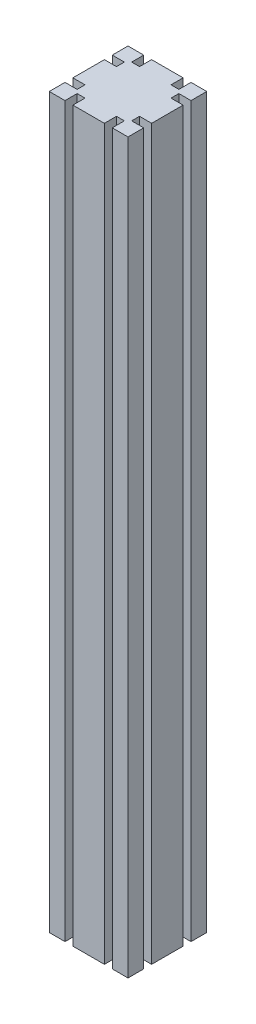
ISO-10303-21;
HEADER;
FILE_DESCRIPTION(('STEP AP214'),'2;1');
FILE_NAME('part.step','',(''),(''),'','','');
FILE_SCHEMA(('AUTOMOTIVE_DESIGN { 1 0 10303 214 1 1 1 1 }'));
ENDSEC;
DATA;
#1=APPLICATION_CONTEXT('core data for automotive mechanical design processes');
#2=APPLICATION_PROTOCOL_DEFINITION('international standard','automotive_design',2000,#1);
#3=PRODUCT_CONTEXT('',#1,'mechanical');
#4=PRODUCT('Part','Part','',(#3));
#5=PRODUCT_RELATED_PRODUCT_CATEGORY('part','',(#4));
#6=PRODUCT_DEFINITION_FORMATION('','',#4);
#7=PRODUCT_DEFINITION_CONTEXT('part definition',#1,'design');
#8=PRODUCT_DEFINITION('design','',#6,#7);
#9=PRODUCT_DEFINITION_SHAPE('','',#8);
#10=(LENGTH_UNIT() NAMED_UNIT(*) SI_UNIT(.MILLI.,.METRE.));
#11=(NAMED_UNIT(*) PLANE_ANGLE_UNIT() SI_UNIT($,.RADIAN.));
#12=(NAMED_UNIT(*) SI_UNIT($,.STERADIAN.) SOLID_ANGLE_UNIT());
#13=UNCERTAINTY_MEASURE_WITH_UNIT(LENGTH_MEASURE(1.E-05),#10,'distance_accuracy_value','');
#14=(GEOMETRIC_REPRESENTATION_CONTEXT(3) GLOBAL_UNCERTAINTY_ASSIGNED_CONTEXT((#13)) GLOBAL_UNIT_ASSIGNED_CONTEXT((#10,
#11,#12)) REPRESENTATION_CONTEXT('',''));
#15=CARTESIAN_POINT('',(0.,0.,0.));
#16=DIRECTION('',(0.,0.,1.));
#17=DIRECTION('',(1.,0.,0.));
#18=AXIS2_PLACEMENT_3D('',#15,#16,#17);
#19=CARTESIAN_POINT('',(-7.3207793932152,740.,0.));
#20=DIRECTION('',(-1.,0.,0.));
#21=DIRECTION('',(0.,0.,1.));
#22=AXIS2_PLACEMENT_3D('',#19,#20,#21);
#23=PLANE('',#22);
#24=DIRECTION('',(0.,0.,-1.));
#25=VECTOR('',#24,1.);
#26=CARTESIAN_POINT('',(-7.3207793932152,0.,0.));
#27=LINE('',#26,#25);
#28=CARTESIAN_POINT('',(-7.3207793932152,0.,-34.4799898452136));
#29=VERTEX_POINT('',#28);
#30=CARTESIAN_POINT('',(-7.3207793932152,0.,-50.4799898452136));
#31=VERTEX_POINT('',#30);
#32=EDGE_CURVE('E299',#29,#31,#27,.T.);
#33=ORIENTED_EDGE('',*,*,#32,.F.);
#34=DIRECTION('',(0.,-1.,0.));
#35=VECTOR('',#34,1.);
#36=CARTESIAN_POINT('',(-7.3207793932152,740.,-34.4799898452136));
#37=LINE('',#36,#35);
#38=CARTESIAN_POINT('',(-7.3207793932152,740.,-34.4799898452136));
#39=VERTEX_POINT('',#38);
#40=EDGE_CURVE('E11',#39,#29,#37,.T.);
#41=ORIENTED_EDGE('',*,*,#40,.F.);
#42=DIRECTION('',(0.,0.,-1.));
#43=VECTOR('',#42,1.);
#44=CARTESIAN_POINT('',(-7.3207793932152,740.,0.));
#45=LINE('',#44,#43);
#46=CARTESIAN_POINT('',(-7.3207793932152,740.,-50.4799898452136));
#47=VERTEX_POINT('',#46);
#48=EDGE_CURVE('E403',#39,#47,#45,.T.);
#49=ORIENTED_EDGE('',*,*,#48,.T.);
#50=DIRECTION('',(0.,-1.,0.));
#51=VECTOR('',#50,1.);
#52=CARTESIAN_POINT('',(-7.3207793932152,740.,-50.4799898452136));
#53=LINE('',#52,#51);
#54=EDGE_CURVE('E54',#47,#31,#53,.T.);
#55=ORIENTED_EDGE('',*,*,#54,.T.);
#56=EDGE_LOOP('',(#33,#41,#49,#55));
#57=FACE_BOUND('',#56,.T.);
#58=ADVANCED_FACE('F38',(#57),#23,.T.);
#59=CARTESIAN_POINT('',(0.,740.,-34.4799898452136));
#60=DIRECTION('',(0.,0.,1.));
#61=DIRECTION('',(1.,0.,0.));
#62=AXIS2_PLACEMENT_3D('',#59,#60,#61);
#63=PLANE('',#62);
#64=DIRECTION('',(-1.,0.,0.));
#65=VECTOR('',#64,1.);
#66=CARTESIAN_POINT('',(0.,0.,-34.4799898452136));
#67=LINE('',#66,#65);
#68=CARTESIAN_POINT('',(4.9792206067848,0.,-34.4799898452136));
#69=VERTEX_POINT('',#68);
#70=EDGE_CURVE('E301',#69,#29,#67,.T.);
#71=ORIENTED_EDGE('',*,*,#70,.F.);
#72=DIRECTION('',(0.,-1.,0.));
#73=VECTOR('',#72,1.);
#74=CARTESIAN_POINT('',(4.9792206067848,740.,-34.4799898452136));
#75=LINE('',#74,#73);
#76=CARTESIAN_POINT('',(4.9792206067848,740.,-34.4799898452136));
#77=VERTEX_POINT('',#76);
#78=EDGE_CURVE('E46',#77,#69,#75,.T.);
#79=ORIENTED_EDGE('',*,*,#78,.F.);
#80=DIRECTION('',(-1.,0.,0.));
#81=VECTOR('',#80,1.);
#82=CARTESIAN_POINT('',(0.,740.,-34.4799898452136));
#83=LINE('',#82,#81);
#84=EDGE_CURVE('E488',#77,#39,#83,.T.);
#85=ORIENTED_EDGE('',*,*,#84,.T.);
#86=ORIENTED_EDGE('',*,*,#40,.T.);
#87=EDGE_LOOP('',(#71,#79,#85,#86));
#88=FACE_BOUND('',#87,.T.);
#89=ADVANCED_FACE('F476',(#88),#63,.T.);
#90=CARTESIAN_POINT('',(4.9792206067848,740.,0.));
#91=DIRECTION('',(-1.,0.,0.));
#92=DIRECTION('',(0.,0.,1.));
#93=AXIS2_PLACEMENT_3D('',#90,#91,#92);
#94=PLANE('',#93);
#95=DIRECTION('',(0.,0.,-1.));
#96=VECTOR('',#95,1.);
#97=CARTESIAN_POINT('',(4.9792206067848,0.,0.));
#98=LINE('',#97,#96);
#99=CARTESIAN_POINT('',(4.9792206067848,0.,-26.4799898452136));
#100=VERTEX_POINT('',#99);
#101=EDGE_CURVE('E304',#100,#69,#98,.T.);
#102=ORIENTED_EDGE('',*,*,#101,.F.);
#103=DIRECTION('',(0.,-1.,0.));
#104=VECTOR('',#103,1.);
#105=CARTESIAN_POINT('',(4.9792206067848,740.,-26.4799898452136));
#106=LINE('',#105,#104);
#107=CARTESIAN_POINT('',(4.9792206067848,740.,-26.4799898452136));
#108=VERTEX_POINT('',#107);
#109=EDGE_CURVE('E465',#108,#100,#106,.T.);
#110=ORIENTED_EDGE('',*,*,#109,.F.);
#111=DIRECTION('',(0.,0.,-1.));
#112=VECTOR('',#111,1.);
#113=CARTESIAN_POINT('',(4.9792206067848,740.,0.));
#114=LINE('',#113,#112);
#115=EDGE_CURVE('E472',#108,#77,#114,.T.);
#116=ORIENTED_EDGE('',*,*,#115,.T.);
#117=ORIENTED_EDGE('',*,*,#78,.T.);
#118=EDGE_LOOP('',(#102,#110,#116,#117));
#119=FACE_BOUND('',#118,.T.);
#120=ADVANCED_FACE('F470',(#119),#94,.T.);
#121=CARTESIAN_POINT('',(0.,740.,-26.4799898452136));
#122=DIRECTION('',(0.,0.,-1.));
#123=DIRECTION('',(-1.,0.,0.));
#124=AXIS2_PLACEMENT_3D('',#121,#122,#123);
#125=PLANE('',#124);
#126=DIRECTION('',(1.,0.,0.));
#127=VECTOR('',#126,1.);
#128=CARTESIAN_POINT('',(0.,0.,-26.4799898452136));
#129=LINE('',#128,#127);
#130=CARTESIAN_POINT('',(-7.3207793932152,0.,-26.4799898452136));
#131=VERTEX_POINT('',#130);
#132=EDGE_CURVE('E307',#131,#100,#129,.T.);
#133=ORIENTED_EDGE('',*,*,#132,.F.);
#134=DIRECTION('',(0.,-1.,0.));
#135=VECTOR('',#134,1.);
#136=CARTESIAN_POINT('',(-7.3207793932152,740.,-26.4799898452136));
#137=LINE('',#136,#135);
#138=CARTESIAN_POINT('',(-7.3207793932152,740.,-26.4799898452136));
#139=VERTEX_POINT('',#138);
#140=EDGE_CURVE('E463',#139,#131,#137,.T.);
#141=ORIENTED_EDGE('',*,*,#140,.F.);
#142=DIRECTION('',(1.,0.,0.));
#143=VECTOR('',#142,1.);
#144=CARTESIAN_POINT('',(0.,740.,-26.4799898452136));
#145=LINE('',#144,#143);
#146=EDGE_CURVE('E485',#139,#108,#145,.T.);
#147=ORIENTED_EDGE('',*,*,#146,.T.);
#148=ORIENTED_EDGE('',*,*,#109,.T.);
#149=EDGE_LOOP('',(#133,#141,#147,#148));
#150=FACE_BOUND('',#149,.T.);
#151=ADVANCED_FACE('F482',(#150),#125,.T.);
#152=CARTESIAN_POINT('',(-7.3207793932152,740.,0.));
#153=DIRECTION('',(-1.,0.,0.));
#154=DIRECTION('',(0.,0.,1.));
#155=AXIS2_PLACEMENT_3D('',#152,#153,#154);
#156=PLANE('',#155);
#157=DIRECTION('',(0.,0.,-1.));
#158=VECTOR('',#157,1.);
#159=CARTESIAN_POINT('',(-7.3207793932152,0.,0.));
#160=LINE('',#159,#158);
#161=CARTESIAN_POINT('',(-7.3207793932152,0.,5.52001015478639));
#162=VERTEX_POINT('',#161);
#163=EDGE_CURVE('E310',#162,#131,#160,.T.);
#164=ORIENTED_EDGE('',*,*,#163,.F.);
#165=DIRECTION('',(0.,-1.,0.));
#166=VECTOR('',#165,1.);
#167=CARTESIAN_POINT('',(-7.3207793932152,740.,5.52001015478639));
#168=LINE('',#167,#166);
#169=CARTESIAN_POINT('',(-7.3207793932152,740.,5.52001015478639));
#170=VERTEX_POINT('',#169);
#171=EDGE_CURVE('E461',#170,#162,#168,.T.);
#172=ORIENTED_EDGE('',*,*,#171,.F.);
#173=DIRECTION('',(0.,0.,-1.));
#174=VECTOR('',#173,1.);
#175=CARTESIAN_POINT('',(-7.3207793932152,740.,0.));
#176=LINE('',#175,#174);
#177=EDGE_CURVE('E490',#170,#139,#176,.T.);
#178=ORIENTED_EDGE('',*,*,#177,.T.);
#179=ORIENTED_EDGE('',*,*,#140,.T.);
#180=EDGE_LOOP('',(#164,#172,#178,#179));
#181=FACE_BOUND('',#180,.T.);
#182=ADVANCED_FACE('F601',(#181),#156,.T.);
#183=CARTESIAN_POINT('',(0.,740.,5.52001015478639));
#184=DIRECTION('',(0.,0.,1.));
#185=DIRECTION('',(1.,0.,0.));
#186=AXIS2_PLACEMENT_3D('',#183,#184,#185);
#187=PLANE('',#186);
#188=DIRECTION('',(-1.,0.,0.));
#189=VECTOR('',#188,1.);
#190=CARTESIAN_POINT('',(0.,0.,5.52001015478639));
#191=LINE('',#190,#189);
#192=CARTESIAN_POINT('',(4.9792206067848,0.,5.52001015478639));
#193=VERTEX_POINT('',#192);
#194=EDGE_CURVE('E313',#193,#162,#191,.T.);
#195=ORIENTED_EDGE('',*,*,#194,.F.);
#196=DIRECTION('',(0.,-1.,0.));
#197=VECTOR('',#196,1.);
#198=CARTESIAN_POINT('',(4.9792206067848,740.,5.52001015478639));
#199=LINE('',#198,#197);
#200=CARTESIAN_POINT('',(4.9792206067848,740.,5.52001015478639));
#201=VERTEX_POINT('',#200);
#202=EDGE_CURVE('E459',#201,#193,#199,.T.);
#203=ORIENTED_EDGE('',*,*,#202,.F.);
#204=DIRECTION('',(-1.,0.,0.));
#205=VECTOR('',#204,1.);
#206=CARTESIAN_POINT('',(0.,740.,5.52001015478639));
#207=LINE('',#206,#205);
#208=EDGE_CURVE('E496',#201,#170,#207,.T.);
#209=ORIENTED_EDGE('',*,*,#208,.T.);
#210=ORIENTED_EDGE('',*,*,#171,.T.);
#211=EDGE_LOOP('',(#195,#203,#209,#210));
#212=FACE_BOUND('',#211,.T.);
#213=ADVANCED_FACE('F604',(#212),#187,.T.);
#214=CARTESIAN_POINT('',(4.9792206067848,740.,0.));
#215=DIRECTION('',(-1.,0.,0.));
#216=DIRECTION('',(0.,0.,1.));
#217=AXIS2_PLACEMENT_3D('',#214,#215,#216);
#218=PLANE('',#217);
#219=DIRECTION('',(0.,0.,-1.));
#220=VECTOR('',#219,1.);
#221=CARTESIAN_POINT('',(4.9792206067848,0.,0.));
#222=LINE('',#221,#220);
#223=CARTESIAN_POINT('',(4.9792206067848,0.,13.5200101547863));
#224=VERTEX_POINT('',#223);
#225=EDGE_CURVE('E316',#224,#193,#222,.T.);
#226=ORIENTED_EDGE('',*,*,#225,.F.);
#227=DIRECTION('',(0.,-1.,0.));
#228=VECTOR('',#227,1.);
#229=CARTESIAN_POINT('',(4.9792206067848,740.,13.5200101547863));
#230=LINE('',#229,#228);
#231=CARTESIAN_POINT('',(4.9792206067848,740.,13.5200101547863));
#232=VERTEX_POINT('',#231);
#233=EDGE_CURVE('E457',#232,#224,#230,.T.);
#234=ORIENTED_EDGE('',*,*,#233,.F.);
#235=DIRECTION('',(0.,0.,-1.));
#236=VECTOR('',#235,1.);
#237=CARTESIAN_POINT('',(4.9792206067848,740.,0.));
#238=LINE('',#237,#236);
#239=EDGE_CURVE('E499',#232,#201,#238,.T.);
#240=ORIENTED_EDGE('',*,*,#239,.T.);
#241=ORIENTED_EDGE('',*,*,#202,.T.);
#242=EDGE_LOOP('',(#226,#234,#240,#241));
#243=FACE_BOUND('',#242,.T.);
#244=ADVANCED_FACE('F608',(#243),#218,.T.);
#245=CARTESIAN_POINT('',(0.,740.,13.5200101547863));
#246=DIRECTION('',(0.,0.,-1.));
#247=DIRECTION('',(-1.,0.,0.));
#248=AXIS2_PLACEMENT_3D('',#245,#246,#247);
#249=PLANE('',#248);
#250=DIRECTION('',(1.,0.,0.));
#251=VECTOR('',#250,1.);
#252=CARTESIAN_POINT('',(0.,0.,13.5200101547863));
#253=LINE('',#252,#251);
#254=CARTESIAN_POINT('',(-7.32077939321523,0.,13.5200101547863));
#255=VERTEX_POINT('',#254);
#256=EDGE_CURVE('E319',#255,#224,#253,.T.);
#257=ORIENTED_EDGE('',*,*,#256,.F.);
#258=DIRECTION('',(0.,-1.,0.));
#259=VECTOR('',#258,1.);
#260=CARTESIAN_POINT('',(-7.32077939321523,740.,13.5200101547863));
#261=LINE('',#260,#259);
#262=CARTESIAN_POINT('',(-7.32077939321523,740.,13.5200101547863));
#263=VERTEX_POINT('',#262);
#264=EDGE_CURVE('E455',#263,#255,#261,.T.);
#265=ORIENTED_EDGE('',*,*,#264,.F.);
#266=DIRECTION('',(1.,0.,0.));
#267=VECTOR('',#266,1.);
#268=CARTESIAN_POINT('',(0.,740.,13.5200101547863));
#269=LINE('',#268,#267);
#270=EDGE_CURVE('E502',#263,#232,#269,.T.);
#271=ORIENTED_EDGE('',*,*,#270,.T.);
#272=ORIENTED_EDGE('',*,*,#233,.T.);
#273=EDGE_LOOP('',(#257,#265,#271,#272));
#274=FACE_BOUND('',#273,.T.);
#275=ADVANCED_FACE('F612',(#274),#249,.T.);
#276=CARTESIAN_POINT('',(-7.32077939321523,740.,0.));
#277=DIRECTION('',(-1.,0.,0.));
#278=DIRECTION('',(0.,0.,1.));
#279=AXIS2_PLACEMENT_3D('',#276,#277,#278);
#280=PLANE('',#279);
#281=DIRECTION('',(0.,0.,-1.));
#282=VECTOR('',#281,1.);
#283=CARTESIAN_POINT('',(-7.32077939321523,0.,0.));
#284=LINE('',#283,#282);
#285=CARTESIAN_POINT('',(-7.32077939321523,0.,29.5200101547863));
#286=VERTEX_POINT('',#285);
#287=EDGE_CURVE('E322',#286,#255,#284,.T.);
#288=ORIENTED_EDGE('',*,*,#287,.F.);
#289=DIRECTION('',(0.,-1.,0.));
#290=VECTOR('',#289,1.);
#291=CARTESIAN_POINT('',(-7.32077939321523,740.,29.5200101547863));
#292=LINE('',#291,#290);
#293=CARTESIAN_POINT('',(-7.32077939321523,740.,29.5200101547863));
#294=VERTEX_POINT('',#293);
#295=EDGE_CURVE('E453',#294,#286,#292,.T.);
#296=ORIENTED_EDGE('',*,*,#295,.F.);
#297=DIRECTION('',(0.,0.,-1.));
#298=VECTOR('',#297,1.);
#299=CARTESIAN_POINT('',(-7.32077939321523,740.,0.));
#300=LINE('',#299,#298);
#301=EDGE_CURVE('E505',#294,#263,#300,.T.);
#302=ORIENTED_EDGE('',*,*,#301,.T.);
#303=ORIENTED_EDGE('',*,*,#264,.T.);
#304=EDGE_LOOP('',(#288,#296,#302,#303));
#305=FACE_BOUND('',#304,.T.);
#306=ADVANCED_FACE('F616',(#305),#280,.T.);
#307=CARTESIAN_POINT('',(0.,740.,29.5200101547863));
#308=DIRECTION('',(0.,0.,1.));
#309=DIRECTION('',(1.,0.,0.));
#310=AXIS2_PLACEMENT_3D('',#307,#308,#309);
#311=PLANE('',#310);
#312=DIRECTION('',(-1.,0.,0.));
#313=VECTOR('',#312,1.);
#314=CARTESIAN_POINT('',(0.,0.,29.5200101547863));
#315=LINE('',#314,#313);
#316=CARTESIAN_POINT('',(8.67922060678477,0.,29.5200101547863));
#317=VERTEX_POINT('',#316);
#318=EDGE_CURVE('E325',#317,#286,#315,.T.);
#319=ORIENTED_EDGE('',*,*,#318,.F.);
#320=DIRECTION('',(0.,-1.,0.));
#321=VECTOR('',#320,1.);
#322=CARTESIAN_POINT('',(8.67922060678477,740.,29.5200101547863));
#323=LINE('',#322,#321);
#324=CARTESIAN_POINT('',(8.67922060678477,740.,29.5200101547863));
#325=VERTEX_POINT('',#324);
#326=EDGE_CURVE('E451',#325,#317,#323,.T.);
#327=ORIENTED_EDGE('',*,*,#326,.F.);
#328=DIRECTION('',(-1.,0.,0.));
#329=VECTOR('',#328,1.);
#330=CARTESIAN_POINT('',(0.,740.,29.5200101547863));
#331=LINE('',#330,#329);
#332=EDGE_CURVE('E508',#325,#294,#331,.T.);
#333=ORIENTED_EDGE('',*,*,#332,.T.);
#334=ORIENTED_EDGE('',*,*,#295,.T.);
#335=EDGE_LOOP('',(#319,#327,#333,#334));
#336=FACE_BOUND('',#335,.T.);
#337=ADVANCED_FACE('F620',(#336),#311,.T.);
#338=CARTESIAN_POINT('',(8.67922060678478,740.,0.));
#339=DIRECTION('',(1.,0.,0.));
#340=DIRECTION('',(0.,0.,-1.));
#341=AXIS2_PLACEMENT_3D('',#338,#339,#340);
#342=PLANE('',#341);
#343=DIRECTION('',(0.,0.,1.));
#344=VECTOR('',#343,1.);
#345=CARTESIAN_POINT('',(8.67922060678478,0.,0.));
#346=LINE('',#345,#344);
#347=CARTESIAN_POINT('',(8.67922060678478,0.,17.2200101547863));
#348=VERTEX_POINT('',#347);
#349=EDGE_CURVE('E328',#348,#317,#346,.T.);
#350=ORIENTED_EDGE('',*,*,#349,.F.);
#351=DIRECTION('',(0.,-1.,0.));
#352=VECTOR('',#351,1.);
#353=CARTESIAN_POINT('',(8.67922060678478,740.,17.2200101547863));
#354=LINE('',#353,#352);
#355=CARTESIAN_POINT('',(8.67922060678478,740.,17.2200101547863));
#356=VERTEX_POINT('',#355);
#357=EDGE_CURVE('E449',#356,#348,#354,.T.);
#358=ORIENTED_EDGE('',*,*,#357,.F.);
#359=DIRECTION('',(0.,0.,1.));
#360=VECTOR('',#359,1.);
#361=CARTESIAN_POINT('',(8.67922060678478,740.,0.));
#362=LINE('',#361,#360);
#363=EDGE_CURVE('E511',#356,#325,#362,.T.);
#364=ORIENTED_EDGE('',*,*,#363,.T.);
#365=ORIENTED_EDGE('',*,*,#326,.T.);
#366=EDGE_LOOP('',(#350,#358,#364,#365));
#367=FACE_BOUND('',#366,.T.);
#368=ADVANCED_FACE('F624',(#367),#342,.T.);
#369=CARTESIAN_POINT('',(0.,740.,17.2200101547863));
#370=DIRECTION('',(0.,0.,1.));
#371=DIRECTION('',(1.,0.,0.));
#372=AXIS2_PLACEMENT_3D('',#369,#370,#371);
#373=PLANE('',#372);
#374=DIRECTION('',(-1.,0.,0.));
#375=VECTOR('',#374,1.);
#376=CARTESIAN_POINT('',(0.,0.,17.2200101547863));
#377=LINE('',#376,#375);
#378=CARTESIAN_POINT('',(16.6792206067848,0.,17.2200101547863));
#379=VERTEX_POINT('',#378);
#380=EDGE_CURVE('E331',#379,#348,#377,.T.);
#381=ORIENTED_EDGE('',*,*,#380,.F.);
#382=DIRECTION('',(0.,-1.,0.));
#383=VECTOR('',#382,1.);
#384=CARTESIAN_POINT('',(16.6792206067848,740.,17.2200101547863));
#385=LINE('',#384,#383);
#386=CARTESIAN_POINT('',(16.6792206067848,740.,17.2200101547863));
#387=VERTEX_POINT('',#386);
#388=EDGE_CURVE('E447',#387,#379,#385,.T.);
#389=ORIENTED_EDGE('',*,*,#388,.F.);
#390=DIRECTION('',(-1.,0.,0.));
#391=VECTOR('',#390,1.);
#392=CARTESIAN_POINT('',(0.,740.,17.2200101547863));
#393=LINE('',#392,#391);
#394=EDGE_CURVE('E514',#387,#356,#393,.T.);
#395=ORIENTED_EDGE('',*,*,#394,.T.);
#396=ORIENTED_EDGE('',*,*,#357,.T.);
#397=EDGE_LOOP('',(#381,#389,#395,#396));
#398=FACE_BOUND('',#397,.T.);
#399=ADVANCED_FACE('F628',(#398),#373,.T.);
#400=CARTESIAN_POINT('',(16.6792206067848,740.,0.));
#401=DIRECTION('',(-1.,0.,0.));
#402=DIRECTION('',(0.,0.,1.));
#403=AXIS2_PLACEMENT_3D('',#400,#401,#402);
#404=PLANE('',#403);
#405=DIRECTION('',(0.,0.,-1.));
#406=VECTOR('',#405,1.);
#407=CARTESIAN_POINT('',(16.6792206067848,0.,0.));
#408=LINE('',#407,#406);
#409=CARTESIAN_POINT('',(16.6792206067848,0.,29.5200101547863));
#410=VERTEX_POINT('',#409);
#411=EDGE_CURVE('E334',#410,#379,#408,.T.);
#412=ORIENTED_EDGE('',*,*,#411,.F.);
#413=DIRECTION('',(0.,-1.,0.));
#414=VECTOR('',#413,1.);
#415=CARTESIAN_POINT('',(16.6792206067848,740.,29.5200101547863));
#416=LINE('',#415,#414);
#417=CARTESIAN_POINT('',(16.6792206067848,740.,29.5200101547863));
#418=VERTEX_POINT('',#417);
#419=EDGE_CURVE('E445',#418,#410,#416,.T.);
#420=ORIENTED_EDGE('',*,*,#419,.F.);
#421=DIRECTION('',(0.,0.,-1.));
#422=VECTOR('',#421,1.);
#423=CARTESIAN_POINT('',(16.6792206067848,740.,0.));
#424=LINE('',#423,#422);
#425=EDGE_CURVE('E517',#418,#387,#424,.T.);
#426=ORIENTED_EDGE('',*,*,#425,.T.);
#427=ORIENTED_EDGE('',*,*,#388,.T.);
#428=EDGE_LOOP('',(#412,#420,#426,#427));
#429=FACE_BOUND('',#428,.T.);
#430=ADVANCED_FACE('F632',(#429),#404,.T.);
#431=CARTESIAN_POINT('',(0.,740.,29.5200101547863));
#432=DIRECTION('',(0.,0.,1.));
#433=DIRECTION('',(1.,0.,0.));
#434=AXIS2_PLACEMENT_3D('',#431,#432,#433);
#435=PLANE('',#434);
#436=DIRECTION('',(-1.,0.,0.));
#437=VECTOR('',#436,1.);
#438=CARTESIAN_POINT('',(0.,0.,29.5200101547863));
#439=LINE('',#438,#437);
#440=CARTESIAN_POINT('',(48.6792206067848,0.,29.5200101547863));
#441=VERTEX_POINT('',#440);
#442=EDGE_CURVE('E337',#441,#410,#439,.T.);
#443=ORIENTED_EDGE('',*,*,#442,.F.);
#444=DIRECTION('',(0.,-1.,0.));
#445=VECTOR('',#444,1.);
#446=CARTESIAN_POINT('',(48.6792206067848,740.,29.5200101547863));
#447=LINE('',#446,#445);
#448=CARTESIAN_POINT('',(48.6792206067848,740.,29.5200101547863));
#449=VERTEX_POINT('',#448);
#450=EDGE_CURVE('E443',#449,#441,#447,.T.);
#451=ORIENTED_EDGE('',*,*,#450,.F.);
#452=DIRECTION('',(-1.,0.,0.));
#453=VECTOR('',#452,1.);
#454=CARTESIAN_POINT('',(0.,740.,29.5200101547863));
#455=LINE('',#454,#453);
#456=EDGE_CURVE('E520',#449,#418,#455,.T.);
#457=ORIENTED_EDGE('',*,*,#456,.T.);
#458=ORIENTED_EDGE('',*,*,#419,.T.);
#459=EDGE_LOOP('',(#443,#451,#457,#458));
#460=FACE_BOUND('',#459,.T.);
#461=ADVANCED_FACE('F636',(#460),#435,.T.);
#462=CARTESIAN_POINT('',(48.6792206067847,740.,-2.19694274546584E-13));
#463=DIRECTION('',(1.,0.,0.));
#464=DIRECTION('',(0.,0.,-1.));
#465=AXIS2_PLACEMENT_3D('',#462,#463,#464);
#466=PLANE('',#465);
#467=DIRECTION('',(0.,0.,1.));
#468=VECTOR('',#467,1.);
#469=CARTESIAN_POINT('',(48.6792206067847,0.,-2.19694274546584E-13));
#470=LINE('',#469,#468);
#471=CARTESIAN_POINT('',(48.6792206067848,0.,17.2200101547863));
#472=VERTEX_POINT('',#471);
#473=EDGE_CURVE('E340',#472,#441,#470,.T.);
#474=ORIENTED_EDGE('',*,*,#473,.F.);
#475=DIRECTION('',(0.,-1.,0.));
#476=VECTOR('',#475,1.);
#477=CARTESIAN_POINT('',(48.6792206067848,740.,17.2200101547863));
#478=LINE('',#477,#476);
#479=CARTESIAN_POINT('',(48.6792206067848,740.,17.2200101547863));
#480=VERTEX_POINT('',#479);
#481=EDGE_CURVE('E441',#480,#472,#478,.T.);
#482=ORIENTED_EDGE('',*,*,#481,.F.);
#483=DIRECTION('',(0.,0.,1.));
#484=VECTOR('',#483,1.);
#485=CARTESIAN_POINT('',(48.6792206067847,740.,-2.19694274546584E-13));
#486=LINE('',#485,#484);
#487=EDGE_CURVE('E523',#480,#449,#486,.T.);
#488=ORIENTED_EDGE('',*,*,#487,.T.);
#489=ORIENTED_EDGE('',*,*,#450,.T.);
#490=EDGE_LOOP('',(#474,#482,#488,#489));
#491=FACE_BOUND('',#490,.T.);
#492=ADVANCED_FACE('F640',(#491),#466,.T.);
#493=CARTESIAN_POINT('',(0.,740.,17.2200101547863));
#494=DIRECTION('',(0.,0.,1.));
#495=DIRECTION('',(1.,0.,0.));
#496=AXIS2_PLACEMENT_3D('',#493,#494,#495);
#497=PLANE('',#496);
#498=DIRECTION('',(-1.,0.,0.));
#499=VECTOR('',#498,1.);
#500=CARTESIAN_POINT('',(0.,0.,17.2200101547863));
#501=LINE('',#500,#499);
#502=CARTESIAN_POINT('',(56.6792206067848,0.,17.2200101547863));
#503=VERTEX_POINT('',#502);
#504=EDGE_CURVE('E343',#503,#472,#501,.T.);
#505=ORIENTED_EDGE('',*,*,#504,.F.);
#506=DIRECTION('',(0.,-1.,0.));
#507=VECTOR('',#506,1.);
#508=CARTESIAN_POINT('',(56.6792206067848,740.,17.2200101547863));
#509=LINE('',#508,#507);
#510=CARTESIAN_POINT('',(56.6792206067848,740.,17.2200101547863));
#511=VERTEX_POINT('',#510);
#512=EDGE_CURVE('E439',#511,#503,#509,.T.);
#513=ORIENTED_EDGE('',*,*,#512,.F.);
#514=DIRECTION('',(-1.,0.,0.));
#515=VECTOR('',#514,1.);
#516=CARTESIAN_POINT('',(0.,740.,17.2200101547863));
#517=LINE('',#516,#515);
#518=EDGE_CURVE('E526',#511,#480,#517,.T.);
#519=ORIENTED_EDGE('',*,*,#518,.T.);
#520=ORIENTED_EDGE('',*,*,#481,.T.);
#521=EDGE_LOOP('',(#505,#513,#519,#520));
#522=FACE_BOUND('',#521,.T.);
#523=ADVANCED_FACE('F644',(#522),#497,.T.);
#524=CARTESIAN_POINT('',(56.6792206067847,740.,-1.91849316266649E-13));
#525=DIRECTION('',(-1.,0.,0.));
#526=DIRECTION('',(0.,0.,1.));
#527=AXIS2_PLACEMENT_3D('',#524,#525,#526);
#528=PLANE('',#527);
#529=DIRECTION('',(0.,0.,-1.));
#530=VECTOR('',#529,1.);
#531=CARTESIAN_POINT('',(56.6792206067847,0.,-1.91849316266649E-13));
#532=LINE('',#531,#530);
#533=CARTESIAN_POINT('',(56.6792206067848,0.,29.5200101547863));
#534=VERTEX_POINT('',#533);
#535=EDGE_CURVE('E346',#534,#503,#532,.T.);
#536=ORIENTED_EDGE('',*,*,#535,.F.);
#537=DIRECTION('',(0.,-1.,0.));
#538=VECTOR('',#537,1.);
#539=CARTESIAN_POINT('',(56.6792206067848,740.,29.5200101547863));
#540=LINE('',#539,#538);
#541=CARTESIAN_POINT('',(56.6792206067848,740.,29.5200101547863));
#542=VERTEX_POINT('',#541);
#543=EDGE_CURVE('E437',#542,#534,#540,.T.);
#544=ORIENTED_EDGE('',*,*,#543,.F.);
#545=DIRECTION('',(0.,0.,-1.));
#546=VECTOR('',#545,1.);
#547=CARTESIAN_POINT('',(56.6792206067847,740.,-1.91849316266649E-13));
#548=LINE('',#547,#546);
#549=EDGE_CURVE('E529',#542,#511,#548,.T.);
#550=ORIENTED_EDGE('',*,*,#549,.T.);
#551=ORIENTED_EDGE('',*,*,#512,.T.);
#552=EDGE_LOOP('',(#536,#544,#550,#551));
#553=FACE_BOUND('',#552,.T.);
#554=ADVANCED_FACE('F648',(#553),#528,.T.);
#555=CARTESIAN_POINT('',(0.,740.,29.5200101547863));
#556=DIRECTION('',(0.,0.,1.));
#557=DIRECTION('',(1.,0.,0.));
#558=AXIS2_PLACEMENT_3D('',#555,#556,#557);
#559=PLANE('',#558);
#560=DIRECTION('',(-1.,0.,0.));
#561=VECTOR('',#560,1.);
#562=CARTESIAN_POINT('',(0.,0.,29.5200101547863));
#563=LINE('',#562,#561);
#564=CARTESIAN_POINT('',(72.6792206067848,0.,29.5200101547863));
#565=VERTEX_POINT('',#564);
#566=EDGE_CURVE('E349',#565,#534,#563,.T.);
#567=ORIENTED_EDGE('',*,*,#566,.F.);
#568=DIRECTION('',(0.,-1.,0.));
#569=VECTOR('',#568,1.);
#570=CARTESIAN_POINT('',(72.6792206067848,740.,29.5200101547863));
#571=LINE('',#570,#569);
#572=CARTESIAN_POINT('',(72.6792206067848,740.,29.5200101547863));
#573=VERTEX_POINT('',#572);
#574=EDGE_CURVE('E435',#573,#565,#571,.T.);
#575=ORIENTED_EDGE('',*,*,#574,.F.);
#576=DIRECTION('',(-1.,0.,0.));
#577=VECTOR('',#576,1.);
#578=CARTESIAN_POINT('',(0.,740.,29.5200101547863));
#579=LINE('',#578,#577);
#580=EDGE_CURVE('E532',#573,#542,#579,.T.);
#581=ORIENTED_EDGE('',*,*,#580,.T.);
#582=ORIENTED_EDGE('',*,*,#543,.T.);
#583=EDGE_LOOP('',(#567,#575,#581,#582));
#584=FACE_BOUND('',#583,.T.);
#585=ADVANCED_FACE('F652',(#584),#559,.T.);
#586=CARTESIAN_POINT('',(72.6792206067848,740.,0.));
#587=DIRECTION('',(1.,0.,0.));
#588=DIRECTION('',(0.,0.,-1.));
#589=AXIS2_PLACEMENT_3D('',#586,#587,#588);
#590=PLANE('',#589);
#591=DIRECTION('',(0.,0.,1.));
#592=VECTOR('',#591,1.);
#593=CARTESIAN_POINT('',(72.6792206067848,0.,0.));
#594=LINE('',#593,#592);
#595=CARTESIAN_POINT('',(72.6792206067848,0.,13.5200101547864));
#596=VERTEX_POINT('',#595);
#597=EDGE_CURVE('E352',#596,#565,#594,.T.);
#598=ORIENTED_EDGE('',*,*,#597,.F.);
#599=DIRECTION('',(0.,-1.,0.));
#600=VECTOR('',#599,1.);
#601=CARTESIAN_POINT('',(72.6792206067848,740.,13.5200101547864));
#602=LINE('',#601,#600);
#603=CARTESIAN_POINT('',(72.6792206067848,740.,13.5200101547864));
#604=VERTEX_POINT('',#603);
#605=EDGE_CURVE('E433',#604,#596,#602,.T.);
#606=ORIENTED_EDGE('',*,*,#605,.F.);
#607=DIRECTION('',(0.,0.,1.));
#608=VECTOR('',#607,1.);
#609=CARTESIAN_POINT('',(72.6792206067848,740.,0.));
#610=LINE('',#609,#608);
#611=EDGE_CURVE('E535',#604,#573,#610,.T.);
#612=ORIENTED_EDGE('',*,*,#611,.T.);
#613=ORIENTED_EDGE('',*,*,#574,.T.);
#614=EDGE_LOOP('',(#598,#606,#612,#613));
#615=FACE_BOUND('',#614,.T.);
#616=ADVANCED_FACE('F656',(#615),#590,.T.);
#617=CARTESIAN_POINT('',(0.,740.,13.5200101547864));
#618=DIRECTION('',(0.,0.,-1.));
#619=DIRECTION('',(-1.,0.,0.));
#620=AXIS2_PLACEMENT_3D('',#617,#618,#619);
#621=PLANE('',#620);
#622=DIRECTION('',(1.,0.,0.));
#623=VECTOR('',#622,1.);
#624=CARTESIAN_POINT('',(0.,0.,13.5200101547864));
#625=LINE('',#624,#623);
#626=CARTESIAN_POINT('',(60.3792206067848,0.,13.5200101547864));
#627=VERTEX_POINT('',#626);
#628=EDGE_CURVE('E355',#627,#596,#625,.T.);
#629=ORIENTED_EDGE('',*,*,#628,.F.);
#630=DIRECTION('',(0.,-1.,0.));
#631=VECTOR('',#630,1.);
#632=CARTESIAN_POINT('',(60.3792206067848,740.,13.5200101547864));
#633=LINE('',#632,#631);
#634=CARTESIAN_POINT('',(60.3792206067848,740.,13.5200101547864));
#635=VERTEX_POINT('',#634);
#636=EDGE_CURVE('E431',#635,#627,#633,.T.);
#637=ORIENTED_EDGE('',*,*,#636,.F.);
#638=DIRECTION('',(1.,0.,0.));
#639=VECTOR('',#638,1.);
#640=CARTESIAN_POINT('',(0.,740.,13.5200101547864));
#641=LINE('',#640,#639);
#642=EDGE_CURVE('E538',#635,#604,#641,.T.);
#643=ORIENTED_EDGE('',*,*,#642,.T.);
#644=ORIENTED_EDGE('',*,*,#605,.T.);
#645=EDGE_LOOP('',(#629,#637,#643,#644));
#646=FACE_BOUND('',#645,.T.);
#647=ADVANCED_FACE('F660',(#646),#621,.T.);
#648=CARTESIAN_POINT('',(60.3792206067848,740.,0.));
#649=DIRECTION('',(1.,0.,0.));
#650=DIRECTION('',(0.,0.,-1.));
#651=AXIS2_PLACEMENT_3D('',#648,#649,#650);
#652=PLANE('',#651);
#653=DIRECTION('',(0.,0.,1.));
#654=VECTOR('',#653,1.);
#655=CARTESIAN_POINT('',(60.3792206067848,0.,0.));
#656=LINE('',#655,#654);
#657=CARTESIAN_POINT('',(60.3792206067848,0.,5.5200101547864));
#658=VERTEX_POINT('',#657);
#659=EDGE_CURVE('E358',#658,#627,#656,.T.);
#660=ORIENTED_EDGE('',*,*,#659,.F.);
#661=DIRECTION('',(0.,-1.,0.));
#662=VECTOR('',#661,1.);
#663=CARTESIAN_POINT('',(60.3792206067848,740.,5.5200101547864));
#664=LINE('',#663,#662);
#665=CARTESIAN_POINT('',(60.3792206067848,740.,5.5200101547864));
#666=VERTEX_POINT('',#665);
#667=EDGE_CURVE('E429',#666,#658,#664,.T.);
#668=ORIENTED_EDGE('',*,*,#667,.F.);
#669=DIRECTION('',(0.,0.,1.));
#670=VECTOR('',#669,1.);
#671=CARTESIAN_POINT('',(60.3792206067848,740.,0.));
#672=LINE('',#671,#670);
#673=EDGE_CURVE('E541',#666,#635,#672,.T.);
#674=ORIENTED_EDGE('',*,*,#673,.T.);
#675=ORIENTED_EDGE('',*,*,#636,.T.);
#676=EDGE_LOOP('',(#660,#668,#674,#675));
#677=FACE_BOUND('',#676,.T.);
#678=ADVANCED_FACE('F664',(#677),#652,.T.);
#679=CARTESIAN_POINT('',(0.,740.,5.52001015478642));
#680=DIRECTION('',(0.,0.,1.));
#681=DIRECTION('',(1.,0.,0.));
#682=AXIS2_PLACEMENT_3D('',#679,#680,#681);
#683=PLANE('',#682);
#684=DIRECTION('',(-1.,0.,0.));
#685=VECTOR('',#684,1.);
#686=CARTESIAN_POINT('',(0.,0.,5.52001015478642));
#687=LINE('',#686,#685);
#688=CARTESIAN_POINT('',(72.6792206067848,0.,5.52001015478639));
#689=VERTEX_POINT('',#688);
#690=EDGE_CURVE('E361',#689,#658,#687,.T.);
#691=ORIENTED_EDGE('',*,*,#690,.F.);
#692=DIRECTION('',(0.,-1.,0.));
#693=VECTOR('',#692,1.);
#694=CARTESIAN_POINT('',(72.6792206067848,740.,5.52001015478639));
#695=LINE('',#694,#693);
#696=CARTESIAN_POINT('',(72.6792206067848,740.,5.52001015478639));
#697=VERTEX_POINT('',#696);
#698=EDGE_CURVE('E427',#697,#689,#695,.T.);
#699=ORIENTED_EDGE('',*,*,#698,.F.);
#700=DIRECTION('',(-1.,0.,0.));
#701=VECTOR('',#700,1.);
#702=CARTESIAN_POINT('',(0.,740.,5.52001015478642));
#703=LINE('',#702,#701);
#704=EDGE_CURVE('E544',#697,#666,#703,.T.);
#705=ORIENTED_EDGE('',*,*,#704,.T.);
#706=ORIENTED_EDGE('',*,*,#667,.T.);
#707=EDGE_LOOP('',(#691,#699,#705,#706));
#708=FACE_BOUND('',#707,.T.);
#709=ADVANCED_FACE('F668',(#708),#683,.T.);
#710=CARTESIAN_POINT('',(72.6792206067848,740.,0.));
#711=DIRECTION('',(1.,0.,0.));
#712=DIRECTION('',(0.,0.,-1.));
#713=AXIS2_PLACEMENT_3D('',#710,#711,#712);
#714=PLANE('',#713);
#715=DIRECTION('',(0.,0.,1.));
#716=VECTOR('',#715,1.);
#717=CARTESIAN_POINT('',(72.6792206067848,0.,0.));
#718=LINE('',#717,#716);
#719=CARTESIAN_POINT('',(72.6792206067848,0.,-26.4799898452136));
#720=VERTEX_POINT('',#719);
#721=EDGE_CURVE('E364',#720,#689,#718,.T.);
#722=ORIENTED_EDGE('',*,*,#721,.F.);
#723=DIRECTION('',(0.,-1.,0.));
#724=VECTOR('',#723,1.);
#725=CARTESIAN_POINT('',(72.6792206067848,740.,-26.4799898452136));
#726=LINE('',#725,#724);
#727=CARTESIAN_POINT('',(72.6792206067848,740.,-26.4799898452136));
#728=VERTEX_POINT('',#727);
#729=EDGE_CURVE('E425',#728,#720,#726,.T.);
#730=ORIENTED_EDGE('',*,*,#729,.F.);
#731=DIRECTION('',(0.,0.,1.));
#732=VECTOR('',#731,1.);
#733=CARTESIAN_POINT('',(72.6792206067848,740.,0.));
#734=LINE('',#733,#732);
#735=EDGE_CURVE('E547',#728,#697,#734,.T.);
#736=ORIENTED_EDGE('',*,*,#735,.T.);
#737=ORIENTED_EDGE('',*,*,#698,.T.);
#738=EDGE_LOOP('',(#722,#730,#736,#737));
#739=FACE_BOUND('',#738,.T.);
#740=ADVANCED_FACE('F672',(#739),#714,.T.);
#741=CARTESIAN_POINT('',(0.,740.,-26.4799898452136));
#742=DIRECTION('',(0.,0.,-1.));
#743=DIRECTION('',(-1.,0.,0.));
#744=AXIS2_PLACEMENT_3D('',#741,#742,#743);
#745=PLANE('',#744);
#746=DIRECTION('',(1.,0.,0.));
#747=VECTOR('',#746,1.);
#748=CARTESIAN_POINT('',(0.,0.,-26.4799898452136));
#749=LINE('',#748,#747);
#750=CARTESIAN_POINT('',(60.3792206067848,0.,-26.4799898452136));
#751=VERTEX_POINT('',#750);
#752=EDGE_CURVE('E367',#751,#720,#749,.T.);
#753=ORIENTED_EDGE('',*,*,#752,.F.);
#754=DIRECTION('',(0.,-1.,0.));
#755=VECTOR('',#754,1.);
#756=CARTESIAN_POINT('',(60.3792206067848,740.,-26.4799898452136));
#757=LINE('',#756,#755);
#758=CARTESIAN_POINT('',(60.3792206067848,740.,-26.4799898452136));
#759=VERTEX_POINT('',#758);
#760=EDGE_CURVE('E423',#759,#751,#757,.T.);
#761=ORIENTED_EDGE('',*,*,#760,.F.);
#762=DIRECTION('',(1.,0.,0.));
#763=VECTOR('',#762,1.);
#764=CARTESIAN_POINT('',(0.,740.,-26.4799898452136));
#765=LINE('',#764,#763);
#766=EDGE_CURVE('E550',#759,#728,#765,.T.);
#767=ORIENTED_EDGE('',*,*,#766,.T.);
#768=ORIENTED_EDGE('',*,*,#729,.T.);
#769=EDGE_LOOP('',(#753,#761,#767,#768));
#770=FACE_BOUND('',#769,.T.);
#771=ADVANCED_FACE('F676',(#770),#745,.T.);
#772=CARTESIAN_POINT('',(60.3792206067848,740.,0.));
#773=DIRECTION('',(1.,0.,0.));
#774=DIRECTION('',(0.,0.,-1.));
#775=AXIS2_PLACEMENT_3D('',#772,#773,#774);
#776=PLANE('',#775);
#777=DIRECTION('',(0.,0.,1.));
#778=VECTOR('',#777,1.);
#779=CARTESIAN_POINT('',(60.3792206067848,0.,0.));
#780=LINE('',#779,#778);
#781=CARTESIAN_POINT('',(60.3792206067848,0.,-34.4799898452136));
#782=VERTEX_POINT('',#781);
#783=EDGE_CURVE('E370',#782,#751,#780,.T.);
#784=ORIENTED_EDGE('',*,*,#783,.F.);
#785=DIRECTION('',(0.,-1.,0.));
#786=VECTOR('',#785,1.);
#787=CARTESIAN_POINT('',(60.3792206067848,740.,-34.4799898452136));
#788=LINE('',#787,#786);
#789=CARTESIAN_POINT('',(60.3792206067848,740.,-34.4799898452136));
#790=VERTEX_POINT('',#789);
#791=EDGE_CURVE('E421',#790,#782,#788,.T.);
#792=ORIENTED_EDGE('',*,*,#791,.F.);
#793=DIRECTION('',(0.,0.,1.));
#794=VECTOR('',#793,1.);
#795=CARTESIAN_POINT('',(60.3792206067848,740.,0.));
#796=LINE('',#795,#794);
#797=EDGE_CURVE('E553',#790,#759,#796,.T.);
#798=ORIENTED_EDGE('',*,*,#797,.T.);
#799=ORIENTED_EDGE('',*,*,#760,.T.);
#800=EDGE_LOOP('',(#784,#792,#798,#799));
#801=FACE_BOUND('',#800,.T.);
#802=ADVANCED_FACE('F680',(#801),#776,.T.);
#803=CARTESIAN_POINT('',(0.,740.,-34.4799898452136));
#804=DIRECTION('',(0.,0.,1.));
#805=DIRECTION('',(1.,0.,0.));
#806=AXIS2_PLACEMENT_3D('',#803,#804,#805);
#807=PLANE('',#806);
#808=DIRECTION('',(-1.,0.,0.));
#809=VECTOR('',#808,1.);
#810=CARTESIAN_POINT('',(0.,0.,-34.4799898452136));
#811=LINE('',#810,#809);
#812=CARTESIAN_POINT('',(72.6792206067848,0.,-34.4799898452136));
#813=VERTEX_POINT('',#812);
#814=EDGE_CURVE('E373',#813,#782,#811,.T.);
#815=ORIENTED_EDGE('',*,*,#814,.F.);
#816=DIRECTION('',(0.,-1.,0.));
#817=VECTOR('',#816,1.);
#818=CARTESIAN_POINT('',(72.6792206067848,740.,-34.4799898452136));
#819=LINE('',#818,#817);
#820=CARTESIAN_POINT('',(72.6792206067848,740.,-34.4799898452136));
#821=VERTEX_POINT('',#820);
#822=EDGE_CURVE('E419',#821,#813,#819,.T.);
#823=ORIENTED_EDGE('',*,*,#822,.F.);
#824=DIRECTION('',(-1.,0.,0.));
#825=VECTOR('',#824,1.);
#826=CARTESIAN_POINT('',(0.,740.,-34.4799898452136));
#827=LINE('',#826,#825);
#828=EDGE_CURVE('E556',#821,#790,#827,.T.);
#829=ORIENTED_EDGE('',*,*,#828,.T.);
#830=ORIENTED_EDGE('',*,*,#791,.T.);
#831=EDGE_LOOP('',(#815,#823,#829,#830));
#832=FACE_BOUND('',#831,.T.);
#833=ADVANCED_FACE('F684',(#832),#807,.T.);
#834=CARTESIAN_POINT('',(72.6792206067848,740.,0.));
#835=DIRECTION('',(1.,0.,0.));
#836=DIRECTION('',(0.,0.,-1.));
#837=AXIS2_PLACEMENT_3D('',#834,#835,#836);
#838=PLANE('',#837);
#839=DIRECTION('',(0.,0.,1.));
#840=VECTOR('',#839,1.);
#841=CARTESIAN_POINT('',(72.6792206067848,0.,0.));
#842=LINE('',#841,#840);
#843=CARTESIAN_POINT('',(72.6792206067848,0.,-50.4799898452136));
#844=VERTEX_POINT('',#843);
#845=EDGE_CURVE('E376',#844,#813,#842,.T.);
#846=ORIENTED_EDGE('',*,*,#845,.F.);
#847=DIRECTION('',(0.,-1.,0.));
#848=VECTOR('',#847,1.);
#849=CARTESIAN_POINT('',(72.6792206067848,740.,-50.4799898452136));
#850=LINE('',#849,#848);
#851=CARTESIAN_POINT('',(72.6792206067848,740.,-50.4799898452136));
#852=VERTEX_POINT('',#851);
#853=EDGE_CURVE('E417',#852,#844,#850,.T.);
#854=ORIENTED_EDGE('',*,*,#853,.F.);
#855=DIRECTION('',(0.,0.,1.));
#856=VECTOR('',#855,1.);
#857=CARTESIAN_POINT('',(72.6792206067848,740.,0.));
#858=LINE('',#857,#856);
#859=EDGE_CURVE('E559',#852,#821,#858,.T.);
#860=ORIENTED_EDGE('',*,*,#859,.T.);
#861=ORIENTED_EDGE('',*,*,#822,.T.);
#862=EDGE_LOOP('',(#846,#854,#860,#861));
#863=FACE_BOUND('',#862,.T.);
#864=ADVANCED_FACE('F688',(#863),#838,.T.);
#865=CARTESIAN_POINT('',(0.,740.,-50.4799898452137));
#866=DIRECTION('',(0.,0.,-1.));
#867=DIRECTION('',(-1.,0.,0.));
#868=AXIS2_PLACEMENT_3D('',#865,#866,#867);
#869=PLANE('',#868);
#870=DIRECTION('',(1.,0.,0.));
#871=VECTOR('',#870,1.);
#872=CARTESIAN_POINT('',(0.,0.,-50.4799898452137));
#873=LINE('',#872,#871);
#874=CARTESIAN_POINT('',(56.6792206067848,0.,-50.4799898452136));
#875=VERTEX_POINT('',#874);
#876=EDGE_CURVE('E379',#875,#844,#873,.T.);
#877=ORIENTED_EDGE('',*,*,#876,.F.);
#878=DIRECTION('',(0.,-1.,0.));
#879=VECTOR('',#878,1.);
#880=CARTESIAN_POINT('',(56.6792206067848,740.,-50.4799898452136));
#881=LINE('',#880,#879);
#882=CARTESIAN_POINT('',(56.6792206067848,740.,-50.4799898452136));
#883=VERTEX_POINT('',#882);
#884=EDGE_CURVE('E415',#883,#875,#881,.T.);
#885=ORIENTED_EDGE('',*,*,#884,.F.);
#886=DIRECTION('',(1.,0.,0.));
#887=VECTOR('',#886,1.);
#888=CARTESIAN_POINT('',(0.,740.,-50.4799898452137));
#889=LINE('',#888,#887);
#890=EDGE_CURVE('E562',#883,#852,#889,.T.);
#891=ORIENTED_EDGE('',*,*,#890,.T.);
#892=ORIENTED_EDGE('',*,*,#853,.T.);
#893=EDGE_LOOP('',(#877,#885,#891,#892));
#894=FACE_BOUND('',#893,.T.);
#895=ADVANCED_FACE('F692',(#894),#869,.T.);
#896=CARTESIAN_POINT('',(56.6792206067848,740.,0.));
#897=DIRECTION('',(-1.,0.,0.));
#898=DIRECTION('',(0.,0.,1.));
#899=AXIS2_PLACEMENT_3D('',#896,#897,#898);
#900=PLANE('',#899);
#901=DIRECTION('',(0.,0.,-1.));
#902=VECTOR('',#901,1.);
#903=CARTESIAN_POINT('',(56.6792206067848,0.,0.));
#904=LINE('',#903,#902);
#905=CARTESIAN_POINT('',(56.6792206067848,0.,-38.1799898452136));
#906=VERTEX_POINT('',#905);
#907=EDGE_CURVE('E382',#906,#875,#904,.T.);
#908=ORIENTED_EDGE('',*,*,#907,.F.);
#909=DIRECTION('',(0.,-1.,0.));
#910=VECTOR('',#909,1.);
#911=CARTESIAN_POINT('',(56.6792206067848,740.,-38.1799898452136));
#912=LINE('',#911,#910);
#913=CARTESIAN_POINT('',(56.6792206067848,740.,-38.1799898452136));
#914=VERTEX_POINT('',#913);
#915=EDGE_CURVE('E413',#914,#906,#912,.T.);
#916=ORIENTED_EDGE('',*,*,#915,.F.);
#917=DIRECTION('',(0.,0.,-1.));
#918=VECTOR('',#917,1.);
#919=CARTESIAN_POINT('',(56.6792206067848,740.,0.));
#920=LINE('',#919,#918);
#921=EDGE_CURVE('E565',#914,#883,#920,.T.);
#922=ORIENTED_EDGE('',*,*,#921,.T.);
#923=ORIENTED_EDGE('',*,*,#884,.T.);
#924=EDGE_LOOP('',(#908,#916,#922,#923));
#925=FACE_BOUND('',#924,.T.);
#926=ADVANCED_FACE('F696',(#925),#900,.T.);
#927=CARTESIAN_POINT('',(0.,740.,-38.1799898452136));
#928=DIRECTION('',(0.,0.,-1.));
#929=DIRECTION('',(-1.,0.,0.));
#930=AXIS2_PLACEMENT_3D('',#927,#928,#929);
#931=PLANE('',#930);
#932=DIRECTION('',(1.,0.,0.));
#933=VECTOR('',#932,1.);
#934=CARTESIAN_POINT('',(0.,0.,-38.1799898452136));
#935=LINE('',#934,#933);
#936=CARTESIAN_POINT('',(48.6792206067848,0.,-38.1799898452136));
#937=VERTEX_POINT('',#936);
#938=EDGE_CURVE('E385',#937,#906,#935,.T.);
#939=ORIENTED_EDGE('',*,*,#938,.F.);
#940=DIRECTION('',(0.,-1.,0.));
#941=VECTOR('',#940,1.);
#942=CARTESIAN_POINT('',(48.6792206067848,740.,-38.1799898452136));
#943=LINE('',#942,#941);
#944=CARTESIAN_POINT('',(48.6792206067848,740.,-38.1799898452136));
#945=VERTEX_POINT('',#944);
#946=EDGE_CURVE('E411',#945,#937,#943,.T.);
#947=ORIENTED_EDGE('',*,*,#946,.F.);
#948=DIRECTION('',(1.,0.,0.));
#949=VECTOR('',#948,1.);
#950=CARTESIAN_POINT('',(0.,740.,-38.1799898452136));
#951=LINE('',#950,#949);
#952=EDGE_CURVE('E568',#945,#914,#951,.T.);
#953=ORIENTED_EDGE('',*,*,#952,.T.);
#954=ORIENTED_EDGE('',*,*,#915,.T.);
#955=EDGE_LOOP('',(#939,#947,#953,#954));
#956=FACE_BOUND('',#955,.T.);
#957=ADVANCED_FACE('F700',(#956),#931,.T.);
#958=CARTESIAN_POINT('',(48.6792206067849,740.,0.));
#959=DIRECTION('',(1.,0.,0.));
#960=DIRECTION('',(0.,0.,-1.));
#961=AXIS2_PLACEMENT_3D('',#958,#959,#960);
#962=PLANE('',#961);
#963=DIRECTION('',(0.,0.,1.));
#964=VECTOR('',#963,1.);
#965=CARTESIAN_POINT('',(48.6792206067849,0.,0.));
#966=LINE('',#965,#964);
#967=CARTESIAN_POINT('',(48.6792206067848,0.,-50.4799898452136));
#968=VERTEX_POINT('',#967);
#969=EDGE_CURVE('E388',#968,#937,#966,.T.);
#970=ORIENTED_EDGE('',*,*,#969,.F.);
#971=DIRECTION('',(0.,-1.,0.));
#972=VECTOR('',#971,1.);
#973=CARTESIAN_POINT('',(48.6792206067848,740.,-50.4799898452136));
#974=LINE('',#973,#972);
#975=CARTESIAN_POINT('',(48.6792206067848,740.,-50.4799898452136));
#976=VERTEX_POINT('',#975);
#977=EDGE_CURVE('E409',#976,#968,#974,.T.);
#978=ORIENTED_EDGE('',*,*,#977,.F.);
#979=DIRECTION('',(0.,0.,1.));
#980=VECTOR('',#979,1.);
#981=CARTESIAN_POINT('',(48.6792206067849,740.,0.));
#982=LINE('',#981,#980);
#983=EDGE_CURVE('E571',#976,#945,#982,.T.);
#984=ORIENTED_EDGE('',*,*,#983,.T.);
#985=ORIENTED_EDGE('',*,*,#946,.T.);
#986=EDGE_LOOP('',(#970,#978,#984,#985));
#987=FACE_BOUND('',#986,.T.);
#988=ADVANCED_FACE('F704',(#987),#962,.T.);
#989=CARTESIAN_POINT('',(0.,740.,-50.4799898452136));
#990=DIRECTION('',(0.,0.,-1.));
#991=DIRECTION('',(-1.,0.,0.));
#992=AXIS2_PLACEMENT_3D('',#989,#990,#991);
#993=PLANE('',#992);
#994=DIRECTION('',(1.,0.,0.));
#995=VECTOR('',#994,1.);
#996=CARTESIAN_POINT('',(0.,0.,-50.4799898452136));
#997=LINE('',#996,#995);
#998=CARTESIAN_POINT('',(16.6792206067848,0.,-50.4799898452136));
#999=VERTEX_POINT('',#998);
#1000=EDGE_CURVE('E391',#999,#968,#997,.T.);
#1001=ORIENTED_EDGE('',*,*,#1000,.F.);
#1002=DIRECTION('',(0.,-1.,0.));
#1003=VECTOR('',#1002,1.);
#1004=CARTESIAN_POINT('',(16.6792206067848,740.,-50.4799898452136));
#1005=LINE('',#1004,#1003);
#1006=CARTESIAN_POINT('',(16.6792206067848,740.,-50.4799898452136));
#1007=VERTEX_POINT('',#1006);
#1008=EDGE_CURVE('E407',#1007,#999,#1005,.T.);
#1009=ORIENTED_EDGE('',*,*,#1008,.F.);
#1010=DIRECTION('',(1.,0.,0.));
#1011=VECTOR('',#1010,1.);
#1012=CARTESIAN_POINT('',(0.,740.,-50.4799898452136));
#1013=LINE('',#1012,#1011);
#1014=EDGE_CURVE('E574',#1007,#976,#1013,.T.);
#1015=ORIENTED_EDGE('',*,*,#1014,.T.);
#1016=ORIENTED_EDGE('',*,*,#977,.T.);
#1017=EDGE_LOOP('',(#1001,#1009,#1015,#1016));
#1018=FACE_BOUND('',#1017,.T.);
#1019=ADVANCED_FACE('F708',(#1018),#993,.T.);
#1020=CARTESIAN_POINT('',(16.6792206067848,740.,0.));
#1021=DIRECTION('',(-1.,0.,0.));
#1022=DIRECTION('',(0.,0.,1.));
#1023=AXIS2_PLACEMENT_3D('',#1020,#1021,#1022);
#1024=PLANE('',#1023);
#1025=DIRECTION('',(0.,0.,-1.));
#1026=VECTOR('',#1025,1.);
#1027=CARTESIAN_POINT('',(16.6792206067848,0.,0.));
#1028=LINE('',#1027,#1026);
#1029=CARTESIAN_POINT('',(16.6792206067848,0.,-38.1799898452136));
#1030=VERTEX_POINT('',#1029);
#1031=EDGE_CURVE('E394',#1030,#999,#1028,.T.);
#1032=ORIENTED_EDGE('',*,*,#1031,.F.);
#1033=DIRECTION('',(0.,-1.,0.));
#1034=VECTOR('',#1033,1.);
#1035=CARTESIAN_POINT('',(16.6792206067848,740.,-38.1799898452136));
#1036=LINE('',#1035,#1034);
#1037=CARTESIAN_POINT('',(16.6792206067848,740.,-38.1799898452136));
#1038=VERTEX_POINT('',#1037);
#1039=EDGE_CURVE('E291',#1038,#1030,#1036,.T.);
#1040=ORIENTED_EDGE('',*,*,#1039,.F.);
#1041=DIRECTION('',(0.,0.,-1.));
#1042=VECTOR('',#1041,1.);
#1043=CARTESIAN_POINT('',(16.6792206067848,740.,0.));
#1044=LINE('',#1043,#1042);
#1045=EDGE_CURVE('E281',#1038,#1007,#1044,.T.);
#1046=ORIENTED_EDGE('',*,*,#1045,.T.);
#1047=ORIENTED_EDGE('',*,*,#1008,.T.);
#1048=EDGE_LOOP('',(#1032,#1040,#1046,#1047));
#1049=FACE_BOUND('',#1048,.T.);
#1050=ADVANCED_FACE('F578',(#1049),#1024,.T.);
#1051=CARTESIAN_POINT('',(0.,740.,-38.1799898452136));
#1052=DIRECTION('',(0.,0.,1.));
#1053=DIRECTION('',(1.,0.,0.));
#1054=AXIS2_PLACEMENT_3D('',#1051,#1052,#1053);
#1055=PLANE('',#1054);
#1056=DIRECTION('',(-1.,0.,0.));
#1057=VECTOR('',#1056,1.);
#1058=CARTESIAN_POINT('',(0.,0.,-38.1799898452136));
#1059=LINE('',#1058,#1057);
#1060=CARTESIAN_POINT('',(8.6792206067848,0.,-38.1799898452136));
#1061=VERTEX_POINT('',#1060);
#1062=EDGE_CURVE('E288',#1030,#1061,#1059,.T.);
#1063=ORIENTED_EDGE('',*,*,#1062,.T.);
#1064=DIRECTION('',(0.,-1.,0.));
#1065=VECTOR('',#1064,1.);
#1066=CARTESIAN_POINT('',(8.6792206067848,740.,-38.1799898452136));
#1067=LINE('',#1066,#1065);
#1068=CARTESIAN_POINT('',(8.6792206067848,740.,-38.1799898452136));
#1069=VERTEX_POINT('',#1068);
#1070=EDGE_CURVE('E285',#1069,#1061,#1067,.T.);
#1071=ORIENTED_EDGE('',*,*,#1070,.F.);
#1072=DIRECTION('',(-1.,0.,0.));
#1073=VECTOR('',#1072,1.);
#1074=CARTESIAN_POINT('',(0.,740.,-38.1799898452136));
#1075=LINE('',#1074,#1073);
#1076=EDGE_CURVE('E273',#1038,#1069,#1075,.T.);
#1077=ORIENTED_EDGE('',*,*,#1076,.F.);
#1078=ORIENTED_EDGE('',*,*,#1039,.T.);
#1079=EDGE_LOOP('',(#1063,#1071,#1077,#1078));
#1080=FACE_BOUND('',#1079,.T.);
#1081=ADVANCED_FACE('F286',(#1080),#1055,.F.);
#1082=CARTESIAN_POINT('',(8.67922060678482,740.,0.));
#1083=DIRECTION('',(1.,0.,0.));
#1084=DIRECTION('',(0.,0.,-1.));
#1085=AXIS2_PLACEMENT_3D('',#1082,#1083,#1084);
#1086=PLANE('',#1085);
#1087=DIRECTION('',(0.,0.,1.));
#1088=VECTOR('',#1087,1.);
#1089=CARTESIAN_POINT('',(8.67922060678482,0.,0.));
#1090=LINE('',#1089,#1088);
#1091=CARTESIAN_POINT('',(8.6792206067848,0.,-50.4799898452136));
#1092=VERTEX_POINT('',#1091);
#1093=EDGE_CURVE('E398',#1092,#1061,#1090,.T.);
#1094=ORIENTED_EDGE('',*,*,#1093,.F.);
#1095=DIRECTION('',(0.,-1.,0.));
#1096=VECTOR('',#1095,1.);
#1097=CARTESIAN_POINT('',(8.6792206067848,740.,-50.4799898452136));
#1098=LINE('',#1097,#1096);
#1099=CARTESIAN_POINT('',(8.6792206067848,740.,-50.4799898452136));
#1100=VERTEX_POINT('',#1099);
#1101=EDGE_CURVE('E163',#1100,#1092,#1098,.T.);
#1102=ORIENTED_EDGE('',*,*,#1101,.F.);
#1103=DIRECTION('',(0.,0.,1.));
#1104=VECTOR('',#1103,1.);
#1105=CARTESIAN_POINT('',(8.67922060678482,740.,0.));
#1106=LINE('',#1105,#1104);
#1107=EDGE_CURVE('E278',#1100,#1069,#1106,.T.);
#1108=ORIENTED_EDGE('',*,*,#1107,.T.);
#1109=ORIENTED_EDGE('',*,*,#1070,.T.);
#1110=EDGE_LOOP('',(#1094,#1102,#1108,#1109));
#1111=FACE_BOUND('',#1110,.T.);
#1112=ADVANCED_FACE('F293',(#1111),#1086,.T.);
#1113=CARTESIAN_POINT('',(0.,740.,-50.4799898452136));
#1114=DIRECTION('',(0.,0.,-1.));
#1115=DIRECTION('',(-1.,0.,0.));
#1116=AXIS2_PLACEMENT_3D('',#1113,#1114,#1115);
#1117=PLANE('',#1116);
#1118=DIRECTION('',(1.,0.,0.));
#1119=VECTOR('',#1118,1.);
#1120=CARTESIAN_POINT('',(0.,0.,-50.4799898452136));
#1121=LINE('',#1120,#1119);
#1122=EDGE_CURVE('E400',#31,#1092,#1121,.T.);
#1123=ORIENTED_EDGE('',*,*,#1122,.F.);
#1124=ORIENTED_EDGE('',*,*,#54,.F.);
#1125=DIRECTION('',(1.,0.,0.));
#1126=VECTOR('',#1125,1.);
#1127=CARTESIAN_POINT('',(0.,740.,-50.4799898452136));
#1128=LINE('',#1127,#1126);
#1129=EDGE_CURVE('E294',#47,#1100,#1128,.T.);
#1130=ORIENTED_EDGE('',*,*,#1129,.T.);
#1131=ORIENTED_EDGE('',*,*,#1101,.T.);
#1132=EDGE_LOOP('',(#1123,#1124,#1130,#1131));
#1133=FACE_BOUND('',#1132,.T.);
#1134=ADVANCED_FACE('F580',(#1133),#1117,.T.);
#1135=CARTESIAN_POINT('',(0.,740.,0.));
#1136=DIRECTION('',(0.,1.,0.));
#1137=DIRECTION('',(0.,0.,1.));
#1138=AXIS2_PLACEMENT_3D('',#1135,#1136,#1137);
#1139=PLANE('',#1138);
#1140=ORIENTED_EDGE('',*,*,#48,.F.);
#1141=ORIENTED_EDGE('',*,*,#84,.F.);
#1142=ORIENTED_EDGE('',*,*,#115,.F.);
#1143=ORIENTED_EDGE('',*,*,#146,.F.);
#1144=ORIENTED_EDGE('',*,*,#177,.F.);
#1145=ORIENTED_EDGE('',*,*,#208,.F.);
#1146=ORIENTED_EDGE('',*,*,#239,.F.);
#1147=ORIENTED_EDGE('',*,*,#270,.F.);
#1148=ORIENTED_EDGE('',*,*,#301,.F.);
#1149=ORIENTED_EDGE('',*,*,#332,.F.);
#1150=ORIENTED_EDGE('',*,*,#363,.F.);
#1151=ORIENTED_EDGE('',*,*,#394,.F.);
#1152=ORIENTED_EDGE('',*,*,#425,.F.);
#1153=ORIENTED_EDGE('',*,*,#456,.F.);
#1154=ORIENTED_EDGE('',*,*,#487,.F.);
#1155=ORIENTED_EDGE('',*,*,#518,.F.);
#1156=ORIENTED_EDGE('',*,*,#549,.F.);
#1157=ORIENTED_EDGE('',*,*,#580,.F.);
#1158=ORIENTED_EDGE('',*,*,#611,.F.);
#1159=ORIENTED_EDGE('',*,*,#642,.F.);
#1160=ORIENTED_EDGE('',*,*,#673,.F.);
#1161=ORIENTED_EDGE('',*,*,#704,.F.);
#1162=ORIENTED_EDGE('',*,*,#735,.F.);
#1163=ORIENTED_EDGE('',*,*,#766,.F.);
#1164=ORIENTED_EDGE('',*,*,#797,.F.);
#1165=ORIENTED_EDGE('',*,*,#828,.F.);
#1166=ORIENTED_EDGE('',*,*,#859,.F.);
#1167=ORIENTED_EDGE('',*,*,#890,.F.);
#1168=ORIENTED_EDGE('',*,*,#921,.F.);
#1169=ORIENTED_EDGE('',*,*,#952,.F.);
#1170=ORIENTED_EDGE('',*,*,#983,.F.);
#1171=ORIENTED_EDGE('',*,*,#1014,.F.);
#1172=ORIENTED_EDGE('',*,*,#1045,.F.);
#1173=ORIENTED_EDGE('',*,*,#1076,.T.);
#1174=ORIENTED_EDGE('',*,*,#1107,.F.);
#1175=ORIENTED_EDGE('',*,*,#1129,.F.);
#1176=EDGE_LOOP('',(#1140,#1141,#1142,#1143,#1144,#1145,#1146,#1147,#1148,#1149,#1150,#1151,
#1152,#1153,#1154,#1155,#1156,#1157,#1158,#1159,#1160,#1161,#1162,#1163,#1164,#1165,#1166,#1167,
#1168,#1169,#1170,#1171,#1172,#1173,#1174,#1175));
#1177=FACE_BOUND('',#1176,.T.);
#1178=ADVANCED_FACE('F275',(#1177),#1139,.T.);
#1179=CARTESIAN_POINT('',(0.,0.,0.));
#1180=DIRECTION('',(0.,1.,0.));
#1181=DIRECTION('',(0.,0.,1.));
#1182=AXIS2_PLACEMENT_3D('',#1179,#1180,#1181);
#1183=PLANE('',#1182);
#1184=ORIENTED_EDGE('',*,*,#32,.T.);
#1185=ORIENTED_EDGE('',*,*,#1122,.T.);
#1186=ORIENTED_EDGE('',*,*,#1093,.T.);
#1187=ORIENTED_EDGE('',*,*,#1062,.F.);
#1188=ORIENTED_EDGE('',*,*,#1031,.T.);
#1189=ORIENTED_EDGE('',*,*,#1000,.T.);
#1190=ORIENTED_EDGE('',*,*,#969,.T.);
#1191=ORIENTED_EDGE('',*,*,#938,.T.);
#1192=ORIENTED_EDGE('',*,*,#907,.T.);
#1193=ORIENTED_EDGE('',*,*,#876,.T.);
#1194=ORIENTED_EDGE('',*,*,#845,.T.);
#1195=ORIENTED_EDGE('',*,*,#814,.T.);
#1196=ORIENTED_EDGE('',*,*,#783,.T.);
#1197=ORIENTED_EDGE('',*,*,#752,.T.);
#1198=ORIENTED_EDGE('',*,*,#721,.T.);
#1199=ORIENTED_EDGE('',*,*,#690,.T.);
#1200=ORIENTED_EDGE('',*,*,#659,.T.);
#1201=ORIENTED_EDGE('',*,*,#628,.T.);
#1202=ORIENTED_EDGE('',*,*,#597,.T.);
#1203=ORIENTED_EDGE('',*,*,#566,.T.);
#1204=ORIENTED_EDGE('',*,*,#535,.T.);
#1205=ORIENTED_EDGE('',*,*,#504,.T.);
#1206=ORIENTED_EDGE('',*,*,#473,.T.);
#1207=ORIENTED_EDGE('',*,*,#442,.T.);
#1208=ORIENTED_EDGE('',*,*,#411,.T.);
#1209=ORIENTED_EDGE('',*,*,#380,.T.);
#1210=ORIENTED_EDGE('',*,*,#349,.T.);
#1211=ORIENTED_EDGE('',*,*,#318,.T.);
#1212=ORIENTED_EDGE('',*,*,#287,.T.);
#1213=ORIENTED_EDGE('',*,*,#256,.T.);
#1214=ORIENTED_EDGE('',*,*,#225,.T.);
#1215=ORIENTED_EDGE('',*,*,#194,.T.);
#1216=ORIENTED_EDGE('',*,*,#163,.T.);
#1217=ORIENTED_EDGE('',*,*,#132,.T.);
#1218=ORIENTED_EDGE('',*,*,#101,.T.);
#1219=ORIENTED_EDGE('',*,*,#70,.T.);
#1220=EDGE_LOOP('',(#1184,#1185,#1186,#1187,#1188,#1189,#1190,#1191,#1192,#1193,#1194,#1195,
#1196,#1197,#1198,#1199,#1200,#1201,#1202,#1203,#1204,#1205,#1206,#1207,#1208,#1209,#1210,#1211,
#1212,#1213,#1214,#1215,#1216,#1217,#1218,#1219));
#1221=FACE_BOUND('',#1220,.T.);
#1222=ADVANCED_FACE('F478',(#1221),#1183,.F.);
#1223=CLOSED_SHELL('',(#58,#89,#120,#151,#182,#213,#244,#275,#306,#337,#368,#399,#430,#461,#492,
#523,#554,#585,#616,#647,#678,#709,#740,#771,#802,#833,#864,#895,#926,#957,#988,#1019,#1050,
#1081,#1112,#1134,#1178,#1222));
#1224=MANIFOLD_SOLID_BREP('B2',#1223);
#1225=ADVANCED_BREP_SHAPE_REPRESENTATION('',(#18,#1224),#14);
#1226=SHAPE_DEFINITION_REPRESENTATION(#9,#1225);
ENDSEC;
END-ISO-10303-21;
